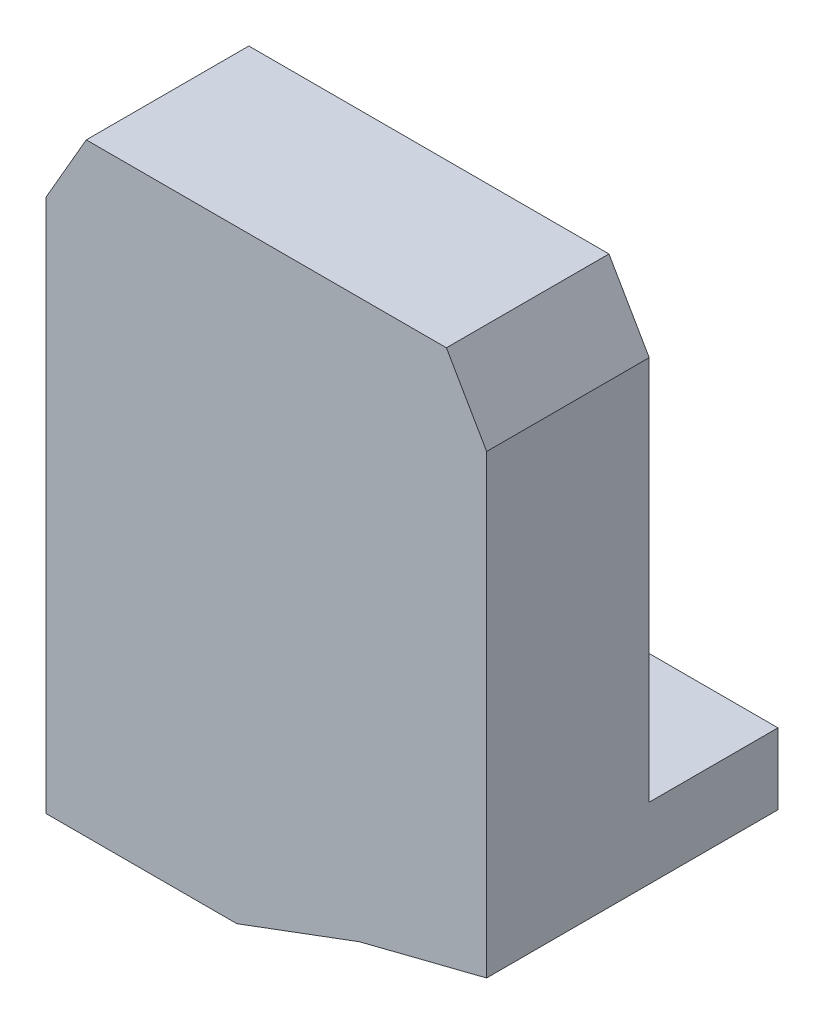
ISO-10303-21;
HEADER;
FILE_DESCRIPTION(('STEP AP214'),'2;1');
FILE_NAME('part.step','',(''),(''),'','','');
FILE_SCHEMA(('AUTOMOTIVE_DESIGN { 1 0 10303 214 1 1 1 1 }'));
ENDSEC;
DATA;
#1=APPLICATION_CONTEXT('core data for automotive mechanical design processes');
#2=APPLICATION_PROTOCOL_DEFINITION('international standard','automotive_design',2000,#1);
#3=PRODUCT_CONTEXT('',#1,'mechanical');
#4=PRODUCT('Part','Part','',(#3));
#5=PRODUCT_RELATED_PRODUCT_CATEGORY('part','',(#4));
#6=PRODUCT_DEFINITION_FORMATION('','',#4);
#7=PRODUCT_DEFINITION_CONTEXT('part definition',#1,'design');
#8=PRODUCT_DEFINITION('design','',#6,#7);
#9=PRODUCT_DEFINITION_SHAPE('','',#8);
#10=(LENGTH_UNIT() NAMED_UNIT(*) SI_UNIT(.MILLI.,.METRE.));
#11=(NAMED_UNIT(*) PLANE_ANGLE_UNIT() SI_UNIT($,.RADIAN.));
#12=(NAMED_UNIT(*) SI_UNIT($,.STERADIAN.) SOLID_ANGLE_UNIT());
#13=UNCERTAINTY_MEASURE_WITH_UNIT(LENGTH_MEASURE(1.E-05),#10,'distance_accuracy_value','');
#14=(GEOMETRIC_REPRESENTATION_CONTEXT(3) GLOBAL_UNCERTAINTY_ASSIGNED_CONTEXT((#13)) GLOBAL_UNIT_ASSIGNED_CONTEXT((#10,
#11,#12)) REPRESENTATION_CONTEXT('',''));
#15=CARTESIAN_POINT('',(0.,0.,0.));
#16=DIRECTION('',(0.,0.,1.));
#17=DIRECTION('',(1.,0.,0.));
#18=AXIS2_PLACEMENT_3D('',#15,#16,#17);
#19=CARTESIAN_POINT('',(-14.6133979135332,15.6500000000015,4.98));
#20=DIRECTION('',(0.,1.,0.));
#21=DIRECTION('',(0.,0.,1.));
#22=AXIS2_PLACEMENT_3D('',#19,#20,#21);
#23=PLANE('',#22);
#24=DIRECTION('',(1.,0.,0.));
#25=VECTOR('',#24,1.);
#26=CARTESIAN_POINT('',(-0.29658201736963,15.6500000000015,4.98));
#27=LINE('',#26,#25);
#28=CARTESIAN_POINT('',(-8.37499999999986,15.6500000000015,4.98));
#29=VERTEX_POINT('',#28);
#30=CARTESIAN_POINT('',(-2.9,15.6500000000015,4.98));
#31=VERTEX_POINT('',#30);
#32=EDGE_CURVE('E111',#29,#31,#27,.T.);
#33=ORIENTED_EDGE('',*,*,#32,.F.);
#34=DIRECTION('',(0.,0.,1.));
#35=VECTOR('',#34,1.);
#36=CARTESIAN_POINT('',(-8.37499999999999,15.6500000000015,4.98));
#37=LINE('',#36,#35);
#38=CARTESIAN_POINT('',(-8.37499999999972,15.6500000000015,6.58));
#39=VERTEX_POINT('',#38);
#40=EDGE_CURVE('E104',#29,#39,#37,.T.);
#41=ORIENTED_EDGE('',*,*,#40,.T.);
#42=DIRECTION('',(1.,0.,0.));
#43=VECTOR('',#42,1.);
#44=CARTESIAN_POINT('',(-14.6133979135332,15.6500000000015,6.58));
#45=LINE('',#44,#43);
#46=CARTESIAN_POINT('',(-2.9,15.6500000000015,6.58));
#47=VERTEX_POINT('',#46);
#48=EDGE_CURVE('E126',#47,#39,#45,.F.);
#49=ORIENTED_EDGE('',*,*,#48,.F.);
#50=DIRECTION('',(0.,0.,1.));
#51=VECTOR('',#50,1.);
#52=CARTESIAN_POINT('',(-2.9,15.6500000000015,4.98));
#53=LINE('',#52,#51);
#54=EDGE_CURVE('E19',#47,#31,#53,.F.);
#55=ORIENTED_EDGE('',*,*,#54,.T.);
#56=EDGE_LOOP('',(#33,#41,#49,#55));
#57=FACE_BOUND('',#56,.T.);
#58=ADVANCED_FACE('F16',(#57),#23,.T.);
#59=CARTESIAN_POINT('',(-4.47882887736633,14.368110240643,4.98));
#60=DIRECTION('',(0.245503467135282,-0.96939571260892,0.));
#61=DIRECTION('',(0.96939571260892,0.245503467135282,0.));
#62=AXIS2_PLACEMENT_3D('',#59,#60,#61);
#63=PLANE('',#62);
#64=DIRECTION('',(-0.969395712608924,-0.245503467135265,0.));
#65=VECTOR('',#64,1.);
#66=CARTESIAN_POINT('',(-2.9,14.76795517328,4.98));
#67=LINE('',#66,#65);
#68=CARTESIAN_POINT('',(-2.9,14.76795517328,4.98));
#69=VERTEX_POINT('',#68);
#70=CARTESIAN_POINT('',(-4.47882887736632,14.368110240643,4.98));
#71=VERTEX_POINT('',#70);
#72=EDGE_CURVE('E89',#69,#71,#67,.T.);
#73=ORIENTED_EDGE('',*,*,#72,.F.);
#74=DIRECTION('',(0.,0.,1.));
#75=VECTOR('',#74,1.);
#76=CARTESIAN_POINT('',(-2.9,14.76795517328,4.98));
#77=LINE('',#76,#75);
#78=CARTESIAN_POINT('',(-2.9,14.76795517328,8.6));
#79=VERTEX_POINT('',#78);
#80=EDGE_CURVE('E100',#79,#69,#77,.F.);
#81=ORIENTED_EDGE('',*,*,#80,.F.);
#82=DIRECTION('',(0.96939571260892,0.245503467135282,0.));
#83=VECTOR('',#82,1.);
#84=CARTESIAN_POINT('',(-4.47882887736633,14.368110240643,8.6));
#85=LINE('',#84,#83);
#86=CARTESIAN_POINT('',(-4.47882887736632,14.368110240643,8.6));
#87=VERTEX_POINT('',#86);
#88=EDGE_CURVE('E94',#79,#87,#85,.F.);
#89=ORIENTED_EDGE('',*,*,#88,.T.);
#90=DIRECTION('',(0.,0.,1.));
#91=VECTOR('',#90,1.);
#92=CARTESIAN_POINT('',(-4.47882887736632,14.368110240643,4.98));
#93=LINE('',#92,#91);
#94=EDGE_CURVE('E97',#71,#87,#93,.T.);
#95=ORIENTED_EDGE('',*,*,#94,.F.);
#96=EDGE_LOOP('',(#73,#81,#89,#95));
#97=FACE_BOUND('',#96,.T.);
#98=ADVANCED_FACE('F96',(#97),#63,.T.);
#99=CARTESIAN_POINT('',(-6.005206074732,13.8,4.98));
#100=DIRECTION('',(0.348817810127209,-0.93719055444347,0.));
#101=DIRECTION('',(0.93719055444347,0.348817810127209,0.));
#102=AXIS2_PLACEMENT_3D('',#99,#100,#101);
#103=PLANE('',#102);
#104=DIRECTION('',(-0.937190554443465,-0.348817810127223,0.));
#105=VECTOR('',#104,1.);
#106=CARTESIAN_POINT('',(-4.47882887736633,14.368110240643,4.98));
#107=LINE('',#106,#105);
#108=CARTESIAN_POINT('',(-6.005206074732,13.8,4.98));
#109=VERTEX_POINT('',#108);
#110=EDGE_CURVE('E110',#71,#109,#107,.T.);
#111=ORIENTED_EDGE('',*,*,#110,.F.);
#112=ORIENTED_EDGE('',*,*,#94,.T.);
#113=DIRECTION('',(0.93719055444347,0.348817810127209,0.));
#114=VECTOR('',#113,1.);
#115=CARTESIAN_POINT('',(-6.005206074732,13.8,8.6));
#116=LINE('',#115,#114);
#117=CARTESIAN_POINT('',(-6.005206074732,13.8,8.6));
#118=VERTEX_POINT('',#117);
#119=EDGE_CURVE('E103',#87,#118,#116,.F.);
#120=ORIENTED_EDGE('',*,*,#119,.T.);
#121=DIRECTION('',(0.,0.,-1.));
#122=VECTOR('',#121,1.);
#123=CARTESIAN_POINT('',(-6.005206074732,13.8,4.98));
#124=LINE('',#123,#122);
#125=EDGE_CURVE('E156',#109,#118,#124,.F.);
#126=ORIENTED_EDGE('',*,*,#125,.F.);
#127=EDGE_LOOP('',(#111,#112,#120,#126));
#128=FACE_BOUND('',#127,.T.);
#129=ADVANCED_FACE('F107',(#128),#103,.T.);
#130=CARTESIAN_POINT('',(-0.29658201736963,15.9247223769889,4.98));
#131=DIRECTION('',(0.,0.,-1.));
#132=DIRECTION('',(0.,1.,0.));
#133=AXIS2_PLACEMENT_3D('',#130,#131,#132);
#134=PLANE('',#133);
#135=ORIENTED_EDGE('',*,*,#110,.T.);
#136=DIRECTION('',(1.,0.,0.));
#137=VECTOR('',#136,1.);
#138=CARTESIAN_POINT('',(-8.37499999999999,13.8,4.98));
#139=LINE('',#138,#137);
#140=CARTESIAN_POINT('',(-8.37499999999999,13.8,4.98));
#141=VERTEX_POINT('',#140);
#142=EDGE_CURVE('E152',#141,#109,#139,.T.);
#143=ORIENTED_EDGE('',*,*,#142,.F.);
#144=DIRECTION('',(-2.87525172570408E-13,-1.,0.));
#145=VECTOR('',#144,1.);
#146=CARTESIAN_POINT('',(-8.37499999999809,20.4339745962189,4.98));
#147=LINE('',#146,#145);
#148=EDGE_CURVE('E134',#29,#141,#147,.T.);
#149=ORIENTED_EDGE('',*,*,#148,.F.);
#150=ORIENTED_EDGE('',*,*,#32,.T.);
#151=DIRECTION('',(0.,1.,0.));
#152=VECTOR('',#151,1.);
#153=CARTESIAN_POINT('',(-2.9,14.76795517328,4.98));
#154=LINE('',#153,#152);
#155=EDGE_CURVE('E132',#69,#31,#154,.T.);
#156=ORIENTED_EDGE('',*,*,#155,.F.);
#157=ORIENTED_EDGE('',*,*,#72,.T.);
#158=EDGE_LOOP('',(#135,#143,#149,#150,#156,#157));
#159=FACE_BOUND('',#158,.T.);
#160=ADVANCED_FACE('F131',(#159),#134,.T.);
#161=CARTESIAN_POINT('',(-2.9,20.43397459622,4.98));
#162=DIRECTION('',(0.866025403783328,0.500000000001923,0.));
#163=DIRECTION('',(-0.500000000001923,0.866025403783328,0.));
#164=AXIS2_PLACEMENT_3D('',#161,#162,#163);
#165=PLANE('',#164);
#166=DIRECTION('',(0.,0.,1.));
#167=VECTOR('',#166,1.);
#168=CARTESIAN_POINT('',(-3.4,21.3,3.86000000000283));
#169=LINE('',#168,#167);
#170=CARTESIAN_POINT('',(-3.4,21.3,8.6));
#171=VERTEX_POINT('',#170);
#172=CARTESIAN_POINT('',(-3.4,21.3,6.58));
#173=VERTEX_POINT('',#172);
#174=EDGE_CURVE('E179',#171,#173,#169,.F.);
#175=ORIENTED_EDGE('',*,*,#174,.F.);
#176=DIRECTION('',(-0.500000000001923,0.866025403783328,0.));
#177=VECTOR('',#176,1.);
#178=CARTESIAN_POINT('',(-2.9,20.43397459622,8.6));
#179=LINE('',#178,#177);
#180=CARTESIAN_POINT('',(-2.9,20.43397459622,8.6));
#181=VERTEX_POINT('',#180);
#182=EDGE_CURVE('E34',#171,#181,#179,.F.);
#183=ORIENTED_EDGE('',*,*,#182,.T.);
#184=DIRECTION('',(0.,0.,1.));
#185=VECTOR('',#184,1.);
#186=CARTESIAN_POINT('',(-2.9,20.43397459622,4.98));
#187=LINE('',#186,#185);
#188=CARTESIAN_POINT('',(-2.9,20.43397459622,6.58));
#189=VERTEX_POINT('',#188);
#190=EDGE_CURVE('E139',#189,#181,#187,.T.);
#191=ORIENTED_EDGE('',*,*,#190,.F.);
#192=DIRECTION('',(0.500000000001923,-0.866025403783328,0.));
#193=VECTOR('',#192,1.);
#194=CARTESIAN_POINT('',(-3.4,21.3,6.58));
#195=LINE('',#194,#193);
#196=EDGE_CURVE('E147',#173,#189,#195,.T.);
#197=ORIENTED_EDGE('',*,*,#196,.F.);
#198=EDGE_LOOP('',(#175,#183,#191,#197));
#199=FACE_BOUND('',#198,.T.);
#200=ADVANCED_FACE('F194',(#199),#165,.T.);
#201=CARTESIAN_POINT('',(-14.6133979135332,15.6500000000015,6.58));
#202=DIRECTION('',(0.,0.,-1.));
#203=DIRECTION('',(0.,1.,0.));
#204=AXIS2_PLACEMENT_3D('',#201,#202,#203);
#205=PLANE('',#204);
#206=ORIENTED_EDGE('',*,*,#48,.T.);
#207=DIRECTION('',(-2.87525172570408E-13,-1.,0.));
#208=VECTOR('',#207,1.);
#209=CARTESIAN_POINT('',(-8.37499999999809,20.4339745962189,6.58));
#210=LINE('',#209,#208);
#211=CARTESIAN_POINT('',(-8.37499999999877,20.4339745962177,6.58));
#212=VERTEX_POINT('',#211);
#213=EDGE_CURVE('E159',#212,#39,#210,.T.);
#214=ORIENTED_EDGE('',*,*,#213,.F.);
#215=DIRECTION('',(-0.500000000000015,-0.86602540378443,0.));
#216=VECTOR('',#215,1.);
#217=CARTESIAN_POINT('',(-7.87499999999999,21.3,6.58));
#218=LINE('',#217,#216);
#219=CARTESIAN_POINT('',(-7.87499999999999,21.3,6.58));
#220=VERTEX_POINT('',#219);
#221=EDGE_CURVE('E141',#220,#212,#218,.T.);
#222=ORIENTED_EDGE('',*,*,#221,.F.);
#223=DIRECTION('',(1.,0.,0.));
#224=VECTOR('',#223,1.);
#225=CARTESIAN_POINT('',(-3.4,21.3,6.58));
#226=LINE('',#225,#224);
#227=EDGE_CURVE('E174',#173,#220,#226,.F.);
#228=ORIENTED_EDGE('',*,*,#227,.F.);
#229=ORIENTED_EDGE('',*,*,#196,.T.);
#230=DIRECTION('',(0.,1.,0.));
#231=VECTOR('',#230,1.);
#232=CARTESIAN_POINT('',(-2.9,14.76795517328,6.58));
#233=LINE('',#232,#231);
#234=EDGE_CURVE('E136',#47,#189,#233,.T.);
#235=ORIENTED_EDGE('',*,*,#234,.F.);
#236=EDGE_LOOP('',(#206,#214,#222,#228,#229,#235));
#237=FACE_BOUND('',#236,.T.);
#238=ADVANCED_FACE('F191',(#237),#205,.T.);
#239=CARTESIAN_POINT('',(-7.87499999999999,21.3,3.86000000000283));
#240=DIRECTION('',(-0.86602540378443,0.500000000000015,0.));
#241=DIRECTION('',(-0.500000000000015,-0.86602540378443,0.));
#242=AXIS2_PLACEMENT_3D('',#239,#240,#241);
#243=PLANE('',#242);
#244=DIRECTION('',(0.,0.,1.));
#245=VECTOR('',#244,1.);
#246=CARTESIAN_POINT('',(-8.37499999999809,20.4339745962189,4.98));
#247=LINE('',#246,#245);
#248=CARTESIAN_POINT('',(-8.37499999999856,20.4339745962181,8.6));
#249=VERTEX_POINT('',#248);
#250=EDGE_CURVE('E181',#249,#212,#247,.F.);
#251=ORIENTED_EDGE('',*,*,#250,.F.);
#252=DIRECTION('',(-0.500000000000015,-0.86602540378443,0.));
#253=VECTOR('',#252,1.);
#254=CARTESIAN_POINT('',(-7.87499999999999,21.3,8.6));
#255=LINE('',#254,#253);
#256=CARTESIAN_POINT('',(-7.87499999999999,21.3,8.6));
#257=VERTEX_POINT('',#256);
#258=EDGE_CURVE('E137',#249,#257,#255,.F.);
#259=ORIENTED_EDGE('',*,*,#258,.T.);
#260=DIRECTION('',(0.,0.,1.));
#261=VECTOR('',#260,1.);
#262=CARTESIAN_POINT('',(-7.87499999999999,21.3,3.86000000000283));
#263=LINE('',#262,#261);
#264=EDGE_CURVE('E170',#220,#257,#263,.T.);
#265=ORIENTED_EDGE('',*,*,#264,.F.);
#266=ORIENTED_EDGE('',*,*,#221,.T.);
#267=EDGE_LOOP('',(#251,#259,#265,#266));
#268=FACE_BOUND('',#267,.T.);
#269=ADVANCED_FACE('F198',(#268),#243,.T.);
#270=CARTESIAN_POINT('',(-2.9,14.76795517328,4.98));
#271=DIRECTION('',(1.,0.,0.));
#272=DIRECTION('',(0.,1.,0.));
#273=AXIS2_PLACEMENT_3D('',#270,#271,#272);
#274=PLANE('',#273);
#275=DIRECTION('',(0.,1.,0.));
#276=VECTOR('',#275,1.);
#277=CARTESIAN_POINT('',(-2.9,15.9247223769889,8.6));
#278=LINE('',#277,#276);
#279=EDGE_CURVE('E167',#181,#79,#278,.F.);
#280=ORIENTED_EDGE('',*,*,#279,.T.);
#281=ORIENTED_EDGE('',*,*,#80,.T.);
#282=ORIENTED_EDGE('',*,*,#155,.T.);
#283=ORIENTED_EDGE('',*,*,#54,.F.);
#284=ORIENTED_EDGE('',*,*,#234,.T.);
#285=ORIENTED_EDGE('',*,*,#190,.T.);
#286=EDGE_LOOP('',(#280,#281,#282,#283,#284,#285));
#287=FACE_BOUND('',#286,.T.);
#288=ADVANCED_FACE('F135',(#287),#274,.T.);
#289=CARTESIAN_POINT('',(-8.37499999999999,13.8,4.98));
#290=DIRECTION('',(0.,-1.,0.));
#291=DIRECTION('',(0.,0.,-1.));
#292=AXIS2_PLACEMENT_3D('',#289,#290,#291);
#293=PLANE('',#292);
#294=ORIENTED_EDGE('',*,*,#142,.T.);
#295=ORIENTED_EDGE('',*,*,#125,.T.);
#296=DIRECTION('',(1.,0.,0.));
#297=VECTOR('',#296,1.);
#298=CARTESIAN_POINT('',(-0.29658201736963,13.8,8.6));
#299=LINE('',#298,#297);
#300=CARTESIAN_POINT('',(-8.37499999999999,13.8,8.6));
#301=VERTEX_POINT('',#300);
#302=EDGE_CURVE('E117',#118,#301,#299,.F.);
#303=ORIENTED_EDGE('',*,*,#302,.T.);
#304=DIRECTION('',(0.,0.,1.));
#305=VECTOR('',#304,1.);
#306=CARTESIAN_POINT('',(-8.375,13.8,4.98));
#307=LINE('',#306,#305);
#308=EDGE_CURVE('E157',#141,#301,#307,.T.);
#309=ORIENTED_EDGE('',*,*,#308,.F.);
#310=EDGE_LOOP('',(#294,#295,#303,#309));
#311=FACE_BOUND('',#310,.T.);
#312=ADVANCED_FACE('F155',(#311),#293,.T.);
#313=CARTESIAN_POINT('',(-8.37499999999809,20.4339745962189,4.98));
#314=DIRECTION('',(-1.,2.87525172570408E-13,0.));
#315=DIRECTION('',(-2.87525172570408E-13,-1.,0.));
#316=AXIS2_PLACEMENT_3D('',#313,#314,#315);
#317=PLANE('',#316);
#318=DIRECTION('',(0.,1.,0.));
#319=VECTOR('',#318,1.);
#320=CARTESIAN_POINT('',(-8.37499999999999,15.9247223769889,8.6));
#321=LINE('',#320,#319);
#322=EDGE_CURVE('E25',#301,#249,#321,.T.);
#323=ORIENTED_EDGE('',*,*,#322,.T.);
#324=ORIENTED_EDGE('',*,*,#250,.T.);
#325=ORIENTED_EDGE('',*,*,#213,.T.);
#326=ORIENTED_EDGE('',*,*,#40,.F.);
#327=ORIENTED_EDGE('',*,*,#148,.T.);
#328=ORIENTED_EDGE('',*,*,#308,.T.);
#329=EDGE_LOOP('',(#323,#324,#325,#326,#327,#328));
#330=FACE_BOUND('',#329,.T.);
#331=ADVANCED_FACE('F186',(#330),#317,.T.);
#332=CARTESIAN_POINT('',(-3.4,21.3,3.86000000000283));
#333=DIRECTION('',(0.,1.,0.));
#334=DIRECTION('',(0.,0.,1.));
#335=AXIS2_PLACEMENT_3D('',#332,#333,#334);
#336=PLANE('',#335);
#337=ORIENTED_EDGE('',*,*,#264,.T.);
#338=DIRECTION('',(1.,0.,0.));
#339=VECTOR('',#338,1.);
#340=CARTESIAN_POINT('',(-0.29658201736963,21.3,8.6));
#341=LINE('',#340,#339);
#342=EDGE_CURVE('E11',#257,#171,#341,.T.);
#343=ORIENTED_EDGE('',*,*,#342,.T.);
#344=ORIENTED_EDGE('',*,*,#174,.T.);
#345=ORIENTED_EDGE('',*,*,#227,.T.);
#346=EDGE_LOOP('',(#337,#343,#344,#345));
#347=FACE_BOUND('',#346,.T.);
#348=ADVANCED_FACE('F196',(#347),#336,.T.);
#349=CARTESIAN_POINT('',(-0.29658201736963,15.9247223769889,8.6));
#350=DIRECTION('',(0.,0.,-1.));
#351=DIRECTION('',(0.,1.,0.));
#352=AXIS2_PLACEMENT_3D('',#349,#350,#351);
#353=PLANE('',#352);
#354=ORIENTED_EDGE('',*,*,#342,.F.);
#355=ORIENTED_EDGE('',*,*,#258,.F.);
#356=ORIENTED_EDGE('',*,*,#322,.F.);
#357=ORIENTED_EDGE('',*,*,#302,.F.);
#358=ORIENTED_EDGE('',*,*,#119,.F.);
#359=ORIENTED_EDGE('',*,*,#88,.F.);
#360=ORIENTED_EDGE('',*,*,#279,.F.);
#361=ORIENTED_EDGE('',*,*,#182,.F.);
#362=EDGE_LOOP('',(#354,#355,#356,#357,#358,#359,#360,#361));
#363=FACE_BOUND('',#362,.T.);
#364=ADVANCED_FACE('F114',(#363),#353,.F.);
#365=CLOSED_SHELL('',(#58,#98,#129,#160,#200,#238,#269,#288,#312,#331,#348,#364));
#366=MANIFOLD_SOLID_BREP('B1',#365);
#367=ADVANCED_BREP_SHAPE_REPRESENTATION('',(#18,#366),#14);
#368=SHAPE_DEFINITION_REPRESENTATION(#9,#367);
ENDSEC;
END-ISO-10303-21;
